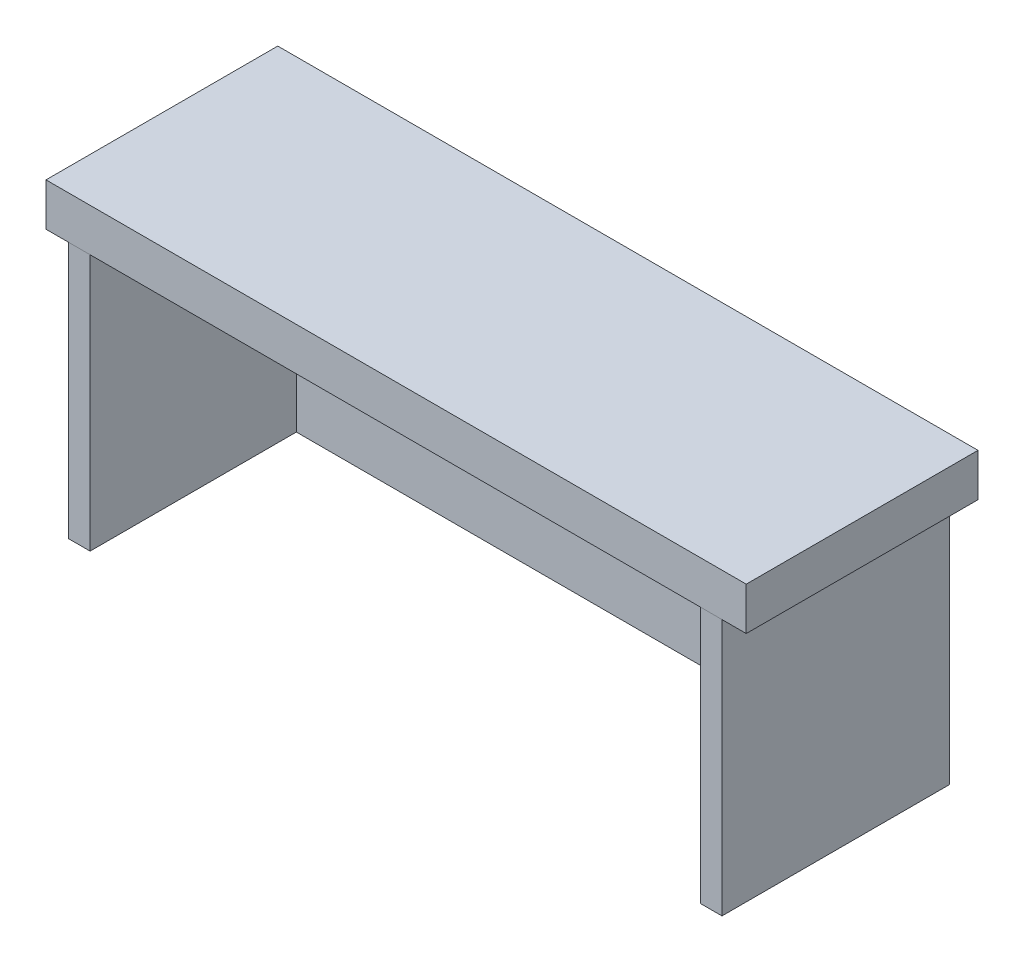
ISO-10303-21;
HEADER;
FILE_DESCRIPTION(('STEP AP214'),'2;1');
FILE_NAME('part.step','',(''),(''),'','','');
FILE_SCHEMA(('AUTOMOTIVE_DESIGN { 1 0 10303 214 1 1 1 1 }'));
ENDSEC;
DATA;
#1=APPLICATION_CONTEXT('core data for automotive mechanical design processes');
#2=APPLICATION_PROTOCOL_DEFINITION('international standard','automotive_design',2000,#1);
#3=PRODUCT_CONTEXT('',#1,'mechanical');
#4=PRODUCT('Part','Part','',(#3));
#5=PRODUCT_RELATED_PRODUCT_CATEGORY('part','',(#4));
#6=PRODUCT_DEFINITION_FORMATION('','',#4);
#7=PRODUCT_DEFINITION_CONTEXT('part definition',#1,'design');
#8=PRODUCT_DEFINITION('design','',#6,#7);
#9=PRODUCT_DEFINITION_SHAPE('','',#8);
#10=(LENGTH_UNIT() NAMED_UNIT(*) SI_UNIT(.MILLI.,.METRE.));
#11=(NAMED_UNIT(*) PLANE_ANGLE_UNIT() SI_UNIT($,.RADIAN.));
#12=(NAMED_UNIT(*) SI_UNIT($,.STERADIAN.) SOLID_ANGLE_UNIT());
#13=UNCERTAINTY_MEASURE_WITH_UNIT(LENGTH_MEASURE(1.E-05),#10,'distance_accuracy_value','');
#14=(GEOMETRIC_REPRESENTATION_CONTEXT(3) GLOBAL_UNCERTAINTY_ASSIGNED_CONTEXT((#13)) GLOBAL_UNIT_ASSIGNED_CONTEXT((#10,
#11,#12)) REPRESENTATION_CONTEXT('',''));
#15=CARTESIAN_POINT('',(0.,0.,0.));
#16=DIRECTION('',(0.,0.,1.));
#17=DIRECTION('',(1.,0.,0.));
#18=AXIS2_PLACEMENT_3D('',#15,#16,#17);
#19=CARTESIAN_POINT('',(7.134486,-1.,4.157855));
#20=DIRECTION('',(-1.,0.,0.));
#21=DIRECTION('',(0.,0.,1.));
#22=AXIS2_PLACEMENT_3D('',#19,#20,#21);
#23=PLANE('',#22);
#24=DIRECTION('',(0.,-1.,0.));
#25=VECTOR('',#24,1.);
#26=CARTESIAN_POINT('',(7.134486,-1.,4.157855));
#27=LINE('',#26,#25);
#28=CARTESIAN_POINT('',(7.134486,-1.,4.157855));
#29=VERTEX_POINT('',#28);
#30=CARTESIAN_POINT('',(7.134486,-7.,4.157855));
#31=VERTEX_POINT('',#30);
#32=EDGE_CURVE('E11',#29,#31,#27,.T.);
#33=ORIENTED_EDGE('',*,*,#32,.T.);
#34=DIRECTION('',(0.,0.,1.));
#35=VECTOR('',#34,1.);
#36=CARTESIAN_POINT('',(7.134486,-7.,4.157855));
#37=LINE('',#36,#35);
#38=CARTESIAN_POINT('',(7.134486,-7.,8.978353));
#39=VERTEX_POINT('',#38);
#40=EDGE_CURVE('E180',#31,#39,#37,.T.);
#41=ORIENTED_EDGE('',*,*,#40,.T.);
#42=DIRECTION('',(0.,-1.,0.));
#43=VECTOR('',#42,1.);
#44=CARTESIAN_POINT('',(7.134486,-1.,8.978353));
#45=LINE('',#44,#43);
#46=CARTESIAN_POINT('',(7.134486,-1.,8.978353));
#47=VERTEX_POINT('',#46);
#48=EDGE_CURVE('E157',#47,#39,#45,.T.);
#49=ORIENTED_EDGE('',*,*,#48,.F.);
#50=DIRECTION('',(0.,0.,1.));
#51=VECTOR('',#50,1.);
#52=CARTESIAN_POINT('',(7.134486,-1.,4.157855));
#53=LINE('',#52,#51);
#54=EDGE_CURVE('E216',#29,#47,#53,.T.);
#55=ORIENTED_EDGE('',*,*,#54,.F.);
#56=EDGE_LOOP('',(#33,#41,#49,#55));
#57=FACE_BOUND('',#56,.T.);
#58=ADVANCED_FACE('F17',(#57),#23,.T.);
#59=CARTESIAN_POINT('',(-7.134486,-1.,4.157855));
#60=DIRECTION('',(0.,0.,1.));
#61=DIRECTION('',(0.,-1.,0.));
#62=AXIS2_PLACEMENT_3D('',#59,#60,#61);
#63=PLANE('',#62);
#64=DIRECTION('',(0.,-1.,0.));
#65=VECTOR('',#64,1.);
#66=CARTESIAN_POINT('',(-7.134486,-1.,4.157855));
#67=LINE('',#66,#65);
#68=CARTESIAN_POINT('',(-7.134486,-1.,4.157855));
#69=VERTEX_POINT('',#68);
#70=CARTESIAN_POINT('',(-7.134486,-7.,4.157855));
#71=VERTEX_POINT('',#70);
#72=EDGE_CURVE('E178',#69,#71,#67,.T.);
#73=ORIENTED_EDGE('',*,*,#72,.T.);
#74=DIRECTION('',(1.,0.,0.));
#75=VECTOR('',#74,1.);
#76=CARTESIAN_POINT('',(-7.134486,-7.,4.157855));
#77=LINE('',#76,#75);
#78=EDGE_CURVE('E26',#71,#31,#77,.T.);
#79=ORIENTED_EDGE('',*,*,#78,.T.);
#80=ORIENTED_EDGE('',*,*,#32,.F.);
#81=DIRECTION('',(1.,0.,0.));
#82=VECTOR('',#81,1.);
#83=CARTESIAN_POINT('',(-7.134486,-1.,4.157855));
#84=LINE('',#83,#82);
#85=EDGE_CURVE('E220',#69,#29,#84,.T.);
#86=ORIENTED_EDGE('',*,*,#85,.F.);
#87=EDGE_LOOP('',(#73,#79,#80,#86));
#88=FACE_BOUND('',#87,.T.);
#89=ADVANCED_FACE('F19',(#88),#63,.T.);
#90=CARTESIAN_POINT('',(0.,-7.,5.012055484157));
#91=DIRECTION('',(0.,1.,0.));
#92=DIRECTION('',(0.,0.,-1.));
#93=AXIS2_PLACEMENT_3D('',#90,#91,#92);
#94=PLANE('',#93);
#95=DIRECTION('',(0.,0.,-1.));
#96=VECTOR('',#95,1.);
#97=CARTESIAN_POINT('',(-7.634486,-7.,8.978353));
#98=LINE('',#97,#96);
#99=CARTESIAN_POINT('',(-7.634486,-7.,8.978353));
#100=VERTEX_POINT('',#99);
#101=CARTESIAN_POINT('',(-7.634486,-7.,3.657855));
#102=VERTEX_POINT('',#101);
#103=EDGE_CURVE('E171',#100,#102,#98,.T.);
#104=ORIENTED_EDGE('',*,*,#103,.T.);
#105=DIRECTION('',(-1.,0.,0.));
#106=VECTOR('',#105,1.);
#107=CARTESIAN_POINT('',(7.634486,-7.,3.657855));
#108=LINE('',#107,#106);
#109=CARTESIAN_POINT('',(7.634486,-7.,3.657855));
#110=VERTEX_POINT('',#109);
#111=EDGE_CURVE('E140',#110,#102,#108,.T.);
#112=ORIENTED_EDGE('',*,*,#111,.F.);
#113=DIRECTION('',(0.,0.,-1.));
#114=VECTOR('',#113,1.);
#115=CARTESIAN_POINT('',(7.634486,-7.,8.978353));
#116=LINE('',#115,#114);
#117=CARTESIAN_POINT('',(7.634486,-7.,8.978353));
#118=VERTEX_POINT('',#117);
#119=EDGE_CURVE('E133',#118,#110,#116,.T.);
#120=ORIENTED_EDGE('',*,*,#119,.F.);
#121=DIRECTION('',(1.,0.,0.));
#122=VECTOR('',#121,1.);
#123=CARTESIAN_POINT('',(7.134486,-7.,8.978353));
#124=LINE('',#123,#122);
#125=EDGE_CURVE('E137',#39,#118,#124,.T.);
#126=ORIENTED_EDGE('',*,*,#125,.F.);
#127=ORIENTED_EDGE('',*,*,#40,.F.);
#128=ORIENTED_EDGE('',*,*,#78,.F.);
#129=DIRECTION('',(0.,0.,-1.));
#130=VECTOR('',#129,1.);
#131=CARTESIAN_POINT('',(-7.134486,-7.,8.978353));
#132=LINE('',#131,#130);
#133=CARTESIAN_POINT('',(-7.134486,-7.,8.978353));
#134=VERTEX_POINT('',#133);
#135=EDGE_CURVE('E174',#134,#71,#132,.T.);
#136=ORIENTED_EDGE('',*,*,#135,.F.);
#137=DIRECTION('',(-1.,0.,0.));
#138=VECTOR('',#137,1.);
#139=CARTESIAN_POINT('',(-7.134486,-7.,8.978353));
#140=LINE('',#139,#138);
#141=EDGE_CURVE('E206',#134,#100,#140,.T.);
#142=ORIENTED_EDGE('',*,*,#141,.T.);
#143=EDGE_LOOP('',(#104,#112,#120,#126,#127,#128,#136,#142));
#144=FACE_BOUND('',#143,.T.);
#145=ADVANCED_FACE('F135',(#144),#94,.F.);
#146=CARTESIAN_POINT('',(-7.134486,-1.,8.978353));
#147=DIRECTION('',(1.,0.,0.));
#148=DIRECTION('',(0.,1.,0.));
#149=AXIS2_PLACEMENT_3D('',#146,#147,#148);
#150=PLANE('',#149);
#151=DIRECTION('',(0.,-1.,0.));
#152=VECTOR('',#151,1.);
#153=CARTESIAN_POINT('',(-7.134486,-1.,8.978353));
#154=LINE('',#153,#152);
#155=CARTESIAN_POINT('',(-7.134486,-1.,8.978353));
#156=VERTEX_POINT('',#155);
#157=EDGE_CURVE('E210',#156,#134,#154,.T.);
#158=ORIENTED_EDGE('',*,*,#157,.T.);
#159=ORIENTED_EDGE('',*,*,#135,.T.);
#160=ORIENTED_EDGE('',*,*,#72,.F.);
#161=DIRECTION('',(0.,0.,-1.));
#162=VECTOR('',#161,1.);
#163=CARTESIAN_POINT('',(-7.134486,-1.,8.978353));
#164=LINE('',#163,#162);
#165=EDGE_CURVE('E164',#156,#69,#164,.T.);
#166=ORIENTED_EDGE('',*,*,#165,.F.);
#167=EDGE_LOOP('',(#158,#159,#160,#166));
#168=FACE_BOUND('',#167,.T.);
#169=ADVANCED_FACE('F270',(#168),#150,.T.);
#170=CARTESIAN_POINT('',(-7.634486,-1.,8.978353));
#171=DIRECTION('',(1.,0.,0.));
#172=DIRECTION('',(0.,1.,0.));
#173=AXIS2_PLACEMENT_3D('',#170,#171,#172);
#174=PLANE('',#173);
#175=DIRECTION('',(0.,0.,-1.));
#176=VECTOR('',#175,1.);
#177=CARTESIAN_POINT('',(-7.634486,-1.,8.978353));
#178=LINE('',#177,#176);
#179=CARTESIAN_POINT('',(-7.634486,-1.,8.978353));
#180=VERTEX_POINT('',#179);
#181=CARTESIAN_POINT('',(-7.634486,-1.,3.657855));
#182=VERTEX_POINT('',#181);
#183=EDGE_CURVE('E234',#180,#182,#178,.T.);
#184=ORIENTED_EDGE('',*,*,#183,.T.);
#185=DIRECTION('',(0.,-1.,0.));
#186=VECTOR('',#185,1.);
#187=CARTESIAN_POINT('',(-7.634486,-1.,3.657855));
#188=LINE('',#187,#186);
#189=EDGE_CURVE('E170',#182,#102,#188,.T.);
#190=ORIENTED_EDGE('',*,*,#189,.T.);
#191=ORIENTED_EDGE('',*,*,#103,.F.);
#192=DIRECTION('',(0.,-1.,0.));
#193=VECTOR('',#192,1.);
#194=CARTESIAN_POINT('',(-7.634486,-1.,8.978353));
#195=LINE('',#194,#193);
#196=EDGE_CURVE('E211',#180,#100,#195,.T.);
#197=ORIENTED_EDGE('',*,*,#196,.F.);
#198=EDGE_LOOP('',(#184,#190,#191,#197));
#199=FACE_BOUND('',#198,.T.);
#200=ADVANCED_FACE('F273',(#199),#174,.F.);
#201=CARTESIAN_POINT('',(7.634486,-1.,3.657855));
#202=DIRECTION('',(0.,0.,-1.));
#203=DIRECTION('',(0.,-1.,0.));
#204=AXIS2_PLACEMENT_3D('',#201,#202,#203);
#205=PLANE('',#204);
#206=DIRECTION('',(0.,-1.,0.));
#207=VECTOR('',#206,1.);
#208=CARTESIAN_POINT('',(7.634486,-1.,3.657855));
#209=LINE('',#208,#207);
#210=CARTESIAN_POINT('',(7.634486,-1.,3.657855));
#211=VERTEX_POINT('',#210);
#212=EDGE_CURVE('E144',#211,#110,#209,.T.);
#213=ORIENTED_EDGE('',*,*,#212,.T.);
#214=ORIENTED_EDGE('',*,*,#111,.T.);
#215=ORIENTED_EDGE('',*,*,#189,.F.);
#216=DIRECTION('',(-1.,0.,0.));
#217=VECTOR('',#216,1.);
#218=CARTESIAN_POINT('',(7.634486,-1.,3.657855));
#219=LINE('',#218,#217);
#220=EDGE_CURVE('E230',#211,#182,#219,.T.);
#221=ORIENTED_EDGE('',*,*,#220,.F.);
#222=EDGE_LOOP('',(#213,#214,#215,#221));
#223=FACE_BOUND('',#222,.T.);
#224=ADVANCED_FACE('F278',(#223),#205,.T.);
#225=CARTESIAN_POINT('',(7.634486,-1.,8.978353));
#226=DIRECTION('',(1.,0.,0.));
#227=DIRECTION('',(0.,1.,0.));
#228=AXIS2_PLACEMENT_3D('',#225,#226,#227);
#229=PLANE('',#228);
#230=DIRECTION('',(0.,-1.,0.));
#231=VECTOR('',#230,1.);
#232=CARTESIAN_POINT('',(7.634486,-1.,8.978353));
#233=LINE('',#232,#231);
#234=CARTESIAN_POINT('',(7.634486,-1.,8.978353));
#235=VERTEX_POINT('',#234);
#236=EDGE_CURVE('E145',#235,#118,#233,.T.);
#237=ORIENTED_EDGE('',*,*,#236,.T.);
#238=ORIENTED_EDGE('',*,*,#119,.T.);
#239=ORIENTED_EDGE('',*,*,#212,.F.);
#240=DIRECTION('',(0.,0.,-1.));
#241=VECTOR('',#240,1.);
#242=CARTESIAN_POINT('',(7.634486,-1.,8.978353));
#243=LINE('',#242,#241);
#244=EDGE_CURVE('E150',#235,#211,#243,.T.);
#245=ORIENTED_EDGE('',*,*,#244,.F.);
#246=EDGE_LOOP('',(#237,#238,#239,#245));
#247=FACE_BOUND('',#246,.T.);
#248=ADVANCED_FACE('F148',(#247),#229,.T.);
#249=CARTESIAN_POINT('',(8.201491,0.,3.561259));
#250=DIRECTION('',(0.,0.,-1.));
#251=DIRECTION('',(0.,-1.,0.));
#252=AXIS2_PLACEMENT_3D('',#249,#250,#251);
#253=PLANE('',#252);
#254=DIRECTION('',(0.,-1.,0.));
#255=VECTOR('',#254,1.);
#256=CARTESIAN_POINT('',(8.201491,0.,3.561259));
#257=LINE('',#256,#255);
#258=CARTESIAN_POINT('',(8.201491,0.,3.561259));
#259=VERTEX_POINT('',#258);
#260=CARTESIAN_POINT('',(8.201491,-1.,3.561259));
#261=VERTEX_POINT('',#260);
#262=EDGE_CURVE('E215',#259,#261,#257,.T.);
#263=ORIENTED_EDGE('',*,*,#262,.T.);
#264=DIRECTION('',(-1.,0.,0.));
#265=VECTOR('',#264,1.);
#266=CARTESIAN_POINT('',(8.201491,-1.,3.561259));
#267=LINE('',#266,#265);
#268=CARTESIAN_POINT('',(-8.165396,-1.,3.561259));
#269=VERTEX_POINT('',#268);
#270=EDGE_CURVE('E225',#261,#269,#267,.T.);
#271=ORIENTED_EDGE('',*,*,#270,.T.);
#272=DIRECTION('',(0.,-1.,0.));
#273=VECTOR('',#272,1.);
#274=CARTESIAN_POINT('',(-8.165396,0.,3.561259));
#275=LINE('',#274,#273);
#276=CARTESIAN_POINT('',(-8.165396,0.,3.561259));
#277=VERTEX_POINT('',#276);
#278=EDGE_CURVE('E197',#277,#269,#275,.T.);
#279=ORIENTED_EDGE('',*,*,#278,.F.);
#280=DIRECTION('',(-1.,0.,0.));
#281=VECTOR('',#280,1.);
#282=CARTESIAN_POINT('',(8.201491,0.,3.561259));
#283=LINE('',#282,#281);
#284=EDGE_CURVE('E191',#259,#277,#283,.T.);
#285=ORIENTED_EDGE('',*,*,#284,.F.);
#286=EDGE_LOOP('',(#263,#271,#279,#285));
#287=FACE_BOUND('',#286,.T.);
#288=ADVANCED_FACE('F277',(#287),#253,.T.);
#289=CARTESIAN_POINT('',(7.134486,-1.,8.978353));
#290=DIRECTION('',(0.,0.,1.));
#291=DIRECTION('',(0.,-1.,0.));
#292=AXIS2_PLACEMENT_3D('',#289,#290,#291);
#293=PLANE('',#292);
#294=ORIENTED_EDGE('',*,*,#48,.T.);
#295=ORIENTED_EDGE('',*,*,#125,.T.);
#296=ORIENTED_EDGE('',*,*,#236,.F.);
#297=DIRECTION('',(1.,0.,0.));
#298=VECTOR('',#297,1.);
#299=CARTESIAN_POINT('',(7.134486,-1.,8.978353));
#300=LINE('',#299,#298);
#301=EDGE_CURVE('E489',#47,#235,#300,.T.);
#302=ORIENTED_EDGE('',*,*,#301,.F.);
#303=EDGE_LOOP('',(#294,#295,#296,#302));
#304=FACE_BOUND('',#303,.T.);
#305=ADVANCED_FACE('F156',(#304),#293,.T.);
#306=CARTESIAN_POINT('',(0.0180475,-1.,6.269806));
#307=DIRECTION('',(0.,1.,0.));
#308=DIRECTION('',(1.,0.,0.));
#309=AXIS2_PLACEMENT_3D('',#306,#307,#308);
#310=PLANE('',#309);
#311=ORIENTED_EDGE('',*,*,#85,.T.);
#312=ORIENTED_EDGE('',*,*,#54,.T.);
#313=DIRECTION('',(1.,0.,0.));
#314=VECTOR('',#313,1.);
#315=CARTESIAN_POINT('',(-8.165396,-1.,8.978353));
#316=LINE('',#315,#314);
#317=EDGE_CURVE('E501',#156,#47,#316,.T.);
#318=ORIENTED_EDGE('',*,*,#317,.F.);
#319=ORIENTED_EDGE('',*,*,#165,.T.);
#320=EDGE_LOOP('',(#311,#312,#318,#319));
#321=FACE_BOUND('',#320,.T.);
#322=ADVANCED_FACE('F251',(#321),#310,.F.);
#323=CARTESIAN_POINT('',(-7.134486,-1.,8.978353));
#324=DIRECTION('',(0.,0.,-1.));
#325=DIRECTION('',(0.,-1.,0.));
#326=AXIS2_PLACEMENT_3D('',#323,#324,#325);
#327=PLANE('',#326);
#328=DIRECTION('',(-1.,0.,0.));
#329=VECTOR('',#328,1.);
#330=CARTESIAN_POINT('',(-7.134486,-1.,8.978353));
#331=LINE('',#330,#329);
#332=EDGE_CURVE('E505',#156,#180,#331,.T.);
#333=ORIENTED_EDGE('',*,*,#332,.T.);
#334=ORIENTED_EDGE('',*,*,#196,.T.);
#335=ORIENTED_EDGE('',*,*,#141,.F.);
#336=ORIENTED_EDGE('',*,*,#157,.F.);
#337=EDGE_LOOP('',(#333,#334,#335,#336));
#338=FACE_BOUND('',#337,.T.);
#339=ADVANCED_FACE('F264',(#338),#327,.F.);
#340=CARTESIAN_POINT('',(0.0180475,-1.,6.269806));
#341=DIRECTION('',(0.,1.,0.));
#342=DIRECTION('',(1.,0.,0.));
#343=AXIS2_PLACEMENT_3D('',#340,#341,#342);
#344=PLANE('',#343);
#345=ORIENTED_EDGE('',*,*,#270,.F.);
#346=DIRECTION('',(0.,0.,-1.));
#347=VECTOR('',#346,1.);
#348=CARTESIAN_POINT('',(8.201491,-1.,8.978353));
#349=LINE('',#348,#347);
#350=CARTESIAN_POINT('',(8.201491,-1.,8.978353));
#351=VERTEX_POINT('',#350);
#352=EDGE_CURVE('E204',#351,#261,#349,.T.);
#353=ORIENTED_EDGE('',*,*,#352,.F.);
#354=DIRECTION('',(1.,0.,0.));
#355=VECTOR('',#354,1.);
#356=CARTESIAN_POINT('',(-8.165396,-1.,8.978353));
#357=LINE('',#356,#355);
#358=EDGE_CURVE('E484',#235,#351,#357,.T.);
#359=ORIENTED_EDGE('',*,*,#358,.F.);
#360=ORIENTED_EDGE('',*,*,#244,.T.);
#361=ORIENTED_EDGE('',*,*,#220,.T.);
#362=ORIENTED_EDGE('',*,*,#183,.F.);
#363=DIRECTION('',(1.,0.,0.));
#364=VECTOR('',#363,1.);
#365=CARTESIAN_POINT('',(-8.165396,-1.,8.978353));
#366=LINE('',#365,#364);
#367=CARTESIAN_POINT('',(-8.165396,-1.,8.978353));
#368=VERTEX_POINT('',#367);
#369=EDGE_CURVE('E510',#368,#180,#366,.T.);
#370=ORIENTED_EDGE('',*,*,#369,.F.);
#371=DIRECTION('',(0.,0.,1.));
#372=VECTOR('',#371,1.);
#373=CARTESIAN_POINT('',(-8.165396,-1.,3.561259));
#374=LINE('',#373,#372);
#375=EDGE_CURVE('E199',#269,#368,#374,.T.);
#376=ORIENTED_EDGE('',*,*,#375,.F.);
#377=EDGE_LOOP('',(#345,#353,#359,#360,#361,#362,#370,#376));
#378=FACE_BOUND('',#377,.T.);
#379=ADVANCED_FACE('F262',(#378),#344,.F.);
#380=CARTESIAN_POINT('',(0.0180475,0.,6.269806));
#381=DIRECTION('',(0.,1.,0.));
#382=DIRECTION('',(1.,0.,0.));
#383=AXIS2_PLACEMENT_3D('',#380,#381,#382);
#384=PLANE('',#383);
#385=DIRECTION('',(1.,0.,0.));
#386=VECTOR('',#385,1.);
#387=CARTESIAN_POINT('',(-8.165396,0.,8.978353));
#388=LINE('',#387,#386);
#389=CARTESIAN_POINT('',(-8.165396,0.,8.978353));
#390=VERTEX_POINT('',#389);
#391=CARTESIAN_POINT('',(8.201491,0.,8.978353));
#392=VERTEX_POINT('',#391);
#393=EDGE_CURVE('E193',#390,#392,#388,.T.);
#394=ORIENTED_EDGE('',*,*,#393,.T.);
#395=DIRECTION('',(0.,0.,-1.));
#396=VECTOR('',#395,1.);
#397=CARTESIAN_POINT('',(8.201491,0.,8.978353));
#398=LINE('',#397,#396);
#399=EDGE_CURVE('E224',#392,#259,#398,.T.);
#400=ORIENTED_EDGE('',*,*,#399,.T.);
#401=ORIENTED_EDGE('',*,*,#284,.T.);
#402=DIRECTION('',(0.,0.,1.));
#403=VECTOR('',#402,1.);
#404=CARTESIAN_POINT('',(-8.165396,0.,3.561259));
#405=LINE('',#404,#403);
#406=EDGE_CURVE('E202',#277,#390,#405,.T.);
#407=ORIENTED_EDGE('',*,*,#406,.T.);
#408=EDGE_LOOP('',(#394,#400,#401,#407));
#409=FACE_BOUND('',#408,.T.);
#410=ADVANCED_FACE('F345',(#409),#384,.T.);
#411=CARTESIAN_POINT('',(8.201491,0.,8.978353));
#412=DIRECTION('',(1.,0.,0.));
#413=DIRECTION('',(0.,1.,0.));
#414=AXIS2_PLACEMENT_3D('',#411,#412,#413);
#415=PLANE('',#414);
#416=DIRECTION('',(0.,-1.,0.));
#417=VECTOR('',#416,1.);
#418=CARTESIAN_POINT('',(8.201491,0.,8.978353));
#419=LINE('',#418,#417);
#420=EDGE_CURVE('E198',#392,#351,#419,.T.);
#421=ORIENTED_EDGE('',*,*,#420,.T.);
#422=ORIENTED_EDGE('',*,*,#352,.T.);
#423=ORIENTED_EDGE('',*,*,#262,.F.);
#424=ORIENTED_EDGE('',*,*,#399,.F.);
#425=EDGE_LOOP('',(#421,#422,#423,#424));
#426=FACE_BOUND('',#425,.T.);
#427=ADVANCED_FACE('F353',(#426),#415,.T.);
#428=CARTESIAN_POINT('',(-8.165396,0.,3.561259));
#429=DIRECTION('',(-1.,0.,0.));
#430=DIRECTION('',(0.,0.,1.));
#431=AXIS2_PLACEMENT_3D('',#428,#429,#430);
#432=PLANE('',#431);
#433=ORIENTED_EDGE('',*,*,#278,.T.);
#434=ORIENTED_EDGE('',*,*,#375,.T.);
#435=DIRECTION('',(0.,-1.,0.));
#436=VECTOR('',#435,1.);
#437=CARTESIAN_POINT('',(-8.165396,0.,8.978353));
#438=LINE('',#437,#436);
#439=EDGE_CURVE('E527',#390,#368,#438,.T.);
#440=ORIENTED_EDGE('',*,*,#439,.F.);
#441=ORIENTED_EDGE('',*,*,#406,.F.);
#442=EDGE_LOOP('',(#433,#434,#440,#441));
#443=FACE_BOUND('',#442,.T.);
#444=ADVANCED_FACE('F362',(#443),#432,.T.);
#445=CARTESIAN_POINT('',(-8.165396,0.,8.978353));
#446=DIRECTION('',(0.,0.,1.));
#447=DIRECTION('',(0.,-1.,0.));
#448=AXIS2_PLACEMENT_3D('',#445,#446,#447);
#449=PLANE('',#448);
#450=ORIENTED_EDGE('',*,*,#439,.T.);
#451=ORIENTED_EDGE('',*,*,#369,.T.);
#452=ORIENTED_EDGE('',*,*,#332,.F.);
#453=ORIENTED_EDGE('',*,*,#317,.T.);
#454=ORIENTED_EDGE('',*,*,#301,.T.);
#455=ORIENTED_EDGE('',*,*,#358,.T.);
#456=ORIENTED_EDGE('',*,*,#420,.F.);
#457=ORIENTED_EDGE('',*,*,#393,.F.);
#458=EDGE_LOOP('',(#450,#451,#452,#453,#454,#455,#456,#457));
#459=FACE_BOUND('',#458,.T.);
#460=ADVANCED_FACE('F371',(#459),#449,.T.);
#461=CLOSED_SHELL('',(#58,#89,#145,#169,#200,#224,#248,#288,#305,#322,#339,#379,#410,#427,#444,#460));
#462=MANIFOLD_SOLID_BREP('B1',#461);
#463=ADVANCED_BREP_SHAPE_REPRESENTATION('',(#18,#462),#14);
#464=SHAPE_DEFINITION_REPRESENTATION(#9,#463);
ENDSEC;
END-ISO-10303-21;
